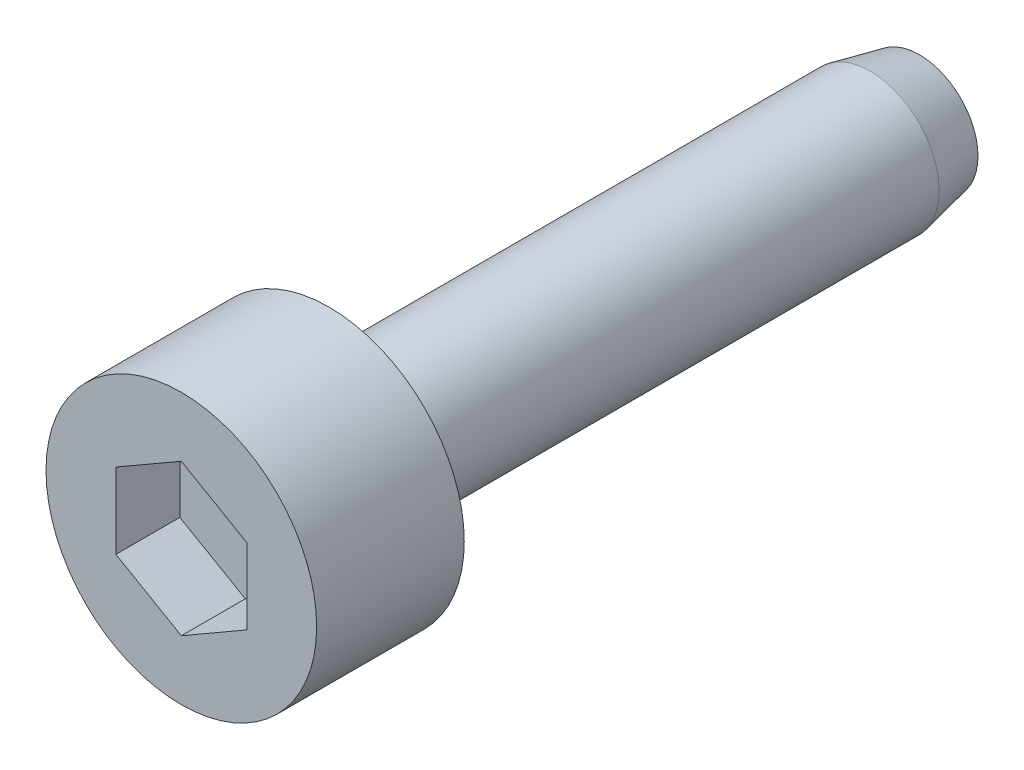
ISO-10303-21;
HEADER;
FILE_DESCRIPTION(('STEP AP214'),'2;1');
FILE_NAME('part.step','',(''),(''),'','','');
FILE_SCHEMA(('AUTOMOTIVE_DESIGN { 1 0 10303 214 1 1 1 1 }'));
ENDSEC;
DATA;
#1=APPLICATION_CONTEXT('core data for automotive mechanical design processes');
#2=APPLICATION_PROTOCOL_DEFINITION('international standard','automotive_design',2000,#1);
#3=PRODUCT_CONTEXT('',#1,'mechanical');
#4=PRODUCT('Part','Part','',(#3));
#5=PRODUCT_RELATED_PRODUCT_CATEGORY('part','',(#4));
#6=PRODUCT_DEFINITION_FORMATION('','',#4);
#7=PRODUCT_DEFINITION_CONTEXT('part definition',#1,'design');
#8=PRODUCT_DEFINITION('design','',#6,#7);
#9=PRODUCT_DEFINITION_SHAPE('','',#8);
#10=(LENGTH_UNIT() NAMED_UNIT(*) SI_UNIT(.MILLI.,.METRE.));
#11=(NAMED_UNIT(*) PLANE_ANGLE_UNIT() SI_UNIT($,.RADIAN.));
#12=(NAMED_UNIT(*) SI_UNIT($,.STERADIAN.) SOLID_ANGLE_UNIT());
#13=UNCERTAINTY_MEASURE_WITH_UNIT(LENGTH_MEASURE(1.E-05),#10,'distance_accuracy_value','');
#14=(GEOMETRIC_REPRESENTATION_CONTEXT(3) GLOBAL_UNCERTAINTY_ASSIGNED_CONTEXT((#13)) GLOBAL_UNIT_ASSIGNED_CONTEXT((#10,
#11,#12)) REPRESENTATION_CONTEXT('',''));
#15=CARTESIAN_POINT('',(0.,0.,0.));
#16=DIRECTION('',(0.,0.,1.));
#17=DIRECTION('',(1.,0.,0.));
#18=AXIS2_PLACEMENT_3D('',#15,#16,#17);
#19=CARTESIAN_POINT('',(0.,0.,-15.));
#20=DIRECTION('',(0.,0.,1.));
#21=DIRECTION('',(1.,0.,0.));
#22=AXIS2_PLACEMENT_3D('',#19,#20,#21);
#23=PLANE('',#22);
#24=CARTESIAN_POINT('',(0.,0.,-15.));
#25=DIRECTION('',(0.,0.,1.));
#26=DIRECTION('',(1.,0.,0.));
#27=AXIS2_PLACEMENT_3D('',#24,#25,#26);
#28=CIRCLE('',#27,1.19);
#29=CARTESIAN_POINT('',(1.19,0.,-15.));
#30=VERTEX_POINT('',#29);
#31=EDGE_CURVE('E10',#30,#30,#28,.T.);
#32=ORIENTED_EDGE('',*,*,#31,.F.);
#33=EDGE_LOOP('',(#32));
#34=FACE_BOUND('',#33,.T.);
#35=ADVANCED_FACE('F16',(#34),#23,.F.);
#36=CARTESIAN_POINT('',(0.,0.,-14.));
#37=DIRECTION('',(0.,0.,1.));
#38=DIRECTION('',(1.,0.,0.));
#39=AXIS2_PLACEMENT_3D('',#36,#37,#38);
#40=CONICAL_SURFACE('',#39,1.4,0.20699219422);
#41=DIRECTION('',(-0.205517234286012,0.,-0.978653496602055));
#42=VECTOR('',#41,1.);
#43=CARTESIAN_POINT('',(1.4,0.,-14.));
#44=LINE('',#43,#42);
#45=CARTESIAN_POINT('',(1.4,0.,-14.));
#46=VERTEX_POINT('',#45);
#47=EDGE_CURVE('E24',#46,#30,#44,.T.);
#48=ORIENTED_EDGE('',*,*,#47,.T.);
#49=ORIENTED_EDGE('',*,*,#31,.T.);
#50=ORIENTED_EDGE('',*,*,#47,.F.);
#51=CARTESIAN_POINT('',(0.,0.,-14.));
#52=DIRECTION('',(0.,0.,1.));
#53=DIRECTION('',(1.,0.,0.));
#54=AXIS2_PLACEMENT_3D('',#51,#52,#53);
#55=CIRCLE('',#54,1.4);
#56=EDGE_CURVE('E198',#46,#46,#55,.T.);
#57=ORIENTED_EDGE('',*,*,#56,.F.);
#58=EDGE_LOOP('',(#48,#49,#50,#57));
#59=FACE_BOUND('',#58,.T.);
#60=ADVANCED_FACE('F202',(#59),#40,.T.);
#61=CARTESIAN_POINT('',(0.,0.,-1.3));
#62=DIRECTION('',(0.,0.,1.));
#63=DIRECTION('',(1.,0.,0.));
#64=AXIS2_PLACEMENT_3D('',#61,#62,#63);
#65=PLANE('',#64);
#66=DIRECTION('',(-0.866025403784329,0.50000000000019,0.));
#67=VECTOR('',#66,1.);
#68=CARTESIAN_POINT('',(1.33,0.767875858022,-1.3));
#69=LINE('',#68,#67);
#70=CARTESIAN_POINT('',(1.33,0.767875858022,-1.3));
#71=VERTEX_POINT('',#70);
#72=CARTESIAN_POINT('',(0.,1.535751716044,-1.3));
#73=VERTEX_POINT('',#72);
#74=EDGE_CURVE('E128',#71,#73,#69,.T.);
#75=ORIENTED_EDGE('',*,*,#74,.T.);
#76=DIRECTION('',(-0.866025403784329,-0.50000000000019,0.));
#77=VECTOR('',#76,1.);
#78=CARTESIAN_POINT('',(0.,1.535751716044,-1.3));
#79=LINE('',#78,#77);
#80=CARTESIAN_POINT('',(-1.33,0.767875858022,-1.3));
#81=VERTEX_POINT('',#80);
#82=EDGE_CURVE('E125',#73,#81,#79,.T.);
#83=ORIENTED_EDGE('',*,*,#82,.T.);
#84=DIRECTION('',(0.,-1.,0.));
#85=VECTOR('',#84,1.);
#86=CARTESIAN_POINT('',(-1.33,0.767875858022,-1.3));
#87=LINE('',#86,#85);
#88=CARTESIAN_POINT('',(-1.33,-0.767875858022,-1.3));
#89=VERTEX_POINT('',#88);
#90=EDGE_CURVE('E179',#81,#89,#87,.T.);
#91=ORIENTED_EDGE('',*,*,#90,.T.);
#92=DIRECTION('',(0.866025403784329,-0.50000000000019,0.));
#93=VECTOR('',#92,1.);
#94=CARTESIAN_POINT('',(-1.33,-0.767875858022,-1.3));
#95=LINE('',#94,#93);
#96=CARTESIAN_POINT('',(0.,-1.535751716044,-1.3));
#97=VERTEX_POINT('',#96);
#98=EDGE_CURVE('E95',#89,#97,#95,.T.);
#99=ORIENTED_EDGE('',*,*,#98,.T.);
#100=DIRECTION('',(0.866025403784329,0.50000000000019,0.));
#101=VECTOR('',#100,1.);
#102=CARTESIAN_POINT('',(0.,-1.535751716044,-1.3));
#103=LINE('',#102,#101);
#104=CARTESIAN_POINT('',(1.33,-0.767875858022,-1.3));
#105=VERTEX_POINT('',#104);
#106=EDGE_CURVE('E85',#97,#105,#103,.T.);
#107=ORIENTED_EDGE('',*,*,#106,.T.);
#108=DIRECTION('',(0.,1.,0.));
#109=VECTOR('',#108,1.);
#110=CARTESIAN_POINT('',(1.33,-0.767875858022,-1.3));
#111=LINE('',#110,#109);
#112=EDGE_CURVE('E192',#105,#71,#111,.T.);
#113=ORIENTED_EDGE('',*,*,#112,.T.);
#114=EDGE_LOOP('',(#75,#83,#91,#99,#107,#113));
#115=FACE_BOUND('',#114,.T.);
#116=ADVANCED_FACE('F231',(#115),#65,.T.);
#117=CARTESIAN_POINT('',(0.,0.,-15.));
#118=DIRECTION('',(0.,0.,1.));
#119=DIRECTION('',(1.,0.,0.));
#120=AXIS2_PLACEMENT_3D('',#117,#118,#119);
#121=CYLINDRICAL_SURFACE('',#120,1.4);
#122=DIRECTION('',(0.,0.,1.));
#123=VECTOR('',#122,1.);
#124=CARTESIAN_POINT('',(1.4,0.,-15.));
#125=LINE('',#124,#123);
#126=CARTESIAN_POINT('',(1.4,0.,-3.));
#127=VERTEX_POINT('',#126);
#128=EDGE_CURVE('E195',#46,#127,#125,.T.);
#129=ORIENTED_EDGE('',*,*,#128,.T.);
#130=CARTESIAN_POINT('',(0.,0.,-3.));
#131=DIRECTION('',(0.,0.,1.));
#132=DIRECTION('',(1.,0.,0.));
#133=AXIS2_PLACEMENT_3D('',#130,#131,#132);
#134=CIRCLE('',#133,1.4);
#135=EDGE_CURVE('E129',#127,#127,#134,.T.);
#136=ORIENTED_EDGE('',*,*,#135,.F.);
#137=ORIENTED_EDGE('',*,*,#128,.F.);
#138=ORIENTED_EDGE('',*,*,#56,.T.);
#139=EDGE_LOOP('',(#129,#136,#137,#138));
#140=FACE_BOUND('',#139,.T.);
#141=ADVANCED_FACE('F206',(#140),#121,.T.);
#142=CARTESIAN_POINT('',(1.33,-0.767875858022,0.));
#143=DIRECTION('',(1.,0.,0.));
#144=DIRECTION('',(0.,1.,0.));
#145=AXIS2_PLACEMENT_3D('',#142,#143,#144);
#146=PLANE('',#145);
#147=DIRECTION('',(0.,1.,0.));
#148=VECTOR('',#147,1.);
#149=CARTESIAN_POINT('',(1.33,-0.767875858022,0.));
#150=LINE('',#149,#148);
#151=CARTESIAN_POINT('',(1.33,-0.767875858022,0.));
#152=VERTEX_POINT('',#151);
#153=CARTESIAN_POINT('',(1.33,0.767875858022,0.));
#154=VERTEX_POINT('',#153);
#155=EDGE_CURVE('E144',#152,#154,#150,.T.);
#156=ORIENTED_EDGE('',*,*,#155,.T.);
#157=DIRECTION('',(0.,0.,-1.));
#158=VECTOR('',#157,1.);
#159=CARTESIAN_POINT('',(1.33,0.767875858022,0.));
#160=LINE('',#159,#158);
#161=EDGE_CURVE('E111',#154,#71,#160,.T.);
#162=ORIENTED_EDGE('',*,*,#161,.T.);
#163=ORIENTED_EDGE('',*,*,#112,.F.);
#164=DIRECTION('',(0.,0.,-1.));
#165=VECTOR('',#164,1.);
#166=CARTESIAN_POINT('',(1.33,-0.767875858022,0.));
#167=LINE('',#166,#165);
#168=EDGE_CURVE('E159',#152,#105,#167,.T.);
#169=ORIENTED_EDGE('',*,*,#168,.F.);
#170=EDGE_LOOP('',(#156,#162,#163,#169));
#171=FACE_BOUND('',#170,.T.);
#172=ADVANCED_FACE('F233',(#171),#146,.F.);
#173=CARTESIAN_POINT('',(0.,-1.535751716044,0.));
#174=DIRECTION('',(0.50000000000019,-0.866025403784329,0.));
#175=DIRECTION('',(0.,0.,-1.));
#176=AXIS2_PLACEMENT_3D('',#173,#174,#175);
#177=PLANE('',#176);
#178=DIRECTION('',(0.866025403784329,0.50000000000019,0.));
#179=VECTOR('',#178,1.);
#180=CARTESIAN_POINT('',(0.,-1.535751716044,0.));
#181=LINE('',#180,#179);
#182=CARTESIAN_POINT('',(0.,-1.535751716044,0.));
#183=VERTEX_POINT('',#182);
#184=EDGE_CURVE('E151',#183,#152,#181,.T.);
#185=ORIENTED_EDGE('',*,*,#184,.T.);
#186=ORIENTED_EDGE('',*,*,#168,.T.);
#187=ORIENTED_EDGE('',*,*,#106,.F.);
#188=DIRECTION('',(0.,0.,-1.));
#189=VECTOR('',#188,1.);
#190=CARTESIAN_POINT('',(0.,-1.535751716044,0.));
#191=LINE('',#190,#189);
#192=EDGE_CURVE('E182',#183,#97,#191,.T.);
#193=ORIENTED_EDGE('',*,*,#192,.F.);
#194=EDGE_LOOP('',(#185,#186,#187,#193));
#195=FACE_BOUND('',#194,.T.);
#196=ADVANCED_FACE('F236',(#195),#177,.F.);
#197=CARTESIAN_POINT('',(-1.33,-0.767875858022,0.));
#198=DIRECTION('',(-0.50000000000019,-0.866025403784329,0.));
#199=DIRECTION('',(-0.866025403784329,0.50000000000019,0.));
#200=AXIS2_PLACEMENT_3D('',#197,#198,#199);
#201=PLANE('',#200);
#202=DIRECTION('',(0.866025403784329,-0.50000000000019,0.));
#203=VECTOR('',#202,1.);
#204=CARTESIAN_POINT('',(-1.33,-0.767875858022,0.));
#205=LINE('',#204,#203);
#206=CARTESIAN_POINT('',(-1.33,-0.767875858022,0.));
#207=VERTEX_POINT('',#206);
#208=EDGE_CURVE('E163',#207,#183,#205,.T.);
#209=ORIENTED_EDGE('',*,*,#208,.T.);
#210=ORIENTED_EDGE('',*,*,#192,.T.);
#211=ORIENTED_EDGE('',*,*,#98,.F.);
#212=DIRECTION('',(0.,0.,-1.));
#213=VECTOR('',#212,1.);
#214=CARTESIAN_POINT('',(-1.33,-0.767875858022,0.));
#215=LINE('',#214,#213);
#216=EDGE_CURVE('E175',#207,#89,#215,.T.);
#217=ORIENTED_EDGE('',*,*,#216,.F.);
#218=EDGE_LOOP('',(#209,#210,#211,#217));
#219=FACE_BOUND('',#218,.T.);
#220=ADVANCED_FACE('F237',(#219),#201,.F.);
#221=CARTESIAN_POINT('',(-1.33,0.767875858022,0.));
#222=DIRECTION('',(-1.,0.,0.));
#223=DIRECTION('',(0.,0.,1.));
#224=AXIS2_PLACEMENT_3D('',#221,#222,#223);
#225=PLANE('',#224);
#226=DIRECTION('',(0.,-1.,0.));
#227=VECTOR('',#226,1.);
#228=CARTESIAN_POINT('',(-1.33,0.767875858022,0.));
#229=LINE('',#228,#227);
#230=CARTESIAN_POINT('',(-1.33,0.767875858022,0.));
#231=VERTEX_POINT('',#230);
#232=EDGE_CURVE('E139',#231,#207,#229,.T.);
#233=ORIENTED_EDGE('',*,*,#232,.T.);
#234=ORIENTED_EDGE('',*,*,#216,.T.);
#235=ORIENTED_EDGE('',*,*,#90,.F.);
#236=DIRECTION('',(0.,0.,-1.));
#237=VECTOR('',#236,1.);
#238=CARTESIAN_POINT('',(-1.33,0.767875858022,0.));
#239=LINE('',#238,#237);
#240=EDGE_CURVE('E185',#231,#81,#239,.T.);
#241=ORIENTED_EDGE('',*,*,#240,.F.);
#242=EDGE_LOOP('',(#233,#234,#235,#241));
#243=FACE_BOUND('',#242,.T.);
#244=ADVANCED_FACE('F229',(#243),#225,.F.);
#245=CARTESIAN_POINT('',(0.,1.535751716044,0.));
#246=DIRECTION('',(-0.50000000000019,0.866025403784329,0.));
#247=DIRECTION('',(0.,0.,1.));
#248=AXIS2_PLACEMENT_3D('',#245,#246,#247);
#249=PLANE('',#248);
#250=DIRECTION('',(-0.866025403784329,-0.50000000000019,0.));
#251=VECTOR('',#250,1.);
#252=CARTESIAN_POINT('',(0.,1.535751716044,0.));
#253=LINE('',#252,#251);
#254=CARTESIAN_POINT('',(0.,1.535751716044,0.));
#255=VERTEX_POINT('',#254);
#256=EDGE_CURVE('E122',#255,#231,#253,.T.);
#257=ORIENTED_EDGE('',*,*,#256,.T.);
#258=ORIENTED_EDGE('',*,*,#240,.T.);
#259=ORIENTED_EDGE('',*,*,#82,.F.);
#260=DIRECTION('',(0.,0.,-1.));
#261=VECTOR('',#260,1.);
#262=CARTESIAN_POINT('',(0.,1.535751716044,0.));
#263=LINE('',#262,#261);
#264=EDGE_CURVE('E118',#255,#73,#263,.T.);
#265=ORIENTED_EDGE('',*,*,#264,.F.);
#266=EDGE_LOOP('',(#257,#258,#259,#265));
#267=FACE_BOUND('',#266,.T.);
#268=ADVANCED_FACE('F120',(#267),#249,.F.);
#269=CARTESIAN_POINT('',(1.33,0.767875858022,0.));
#270=DIRECTION('',(0.50000000000019,0.866025403784329,0.));
#271=DIRECTION('',(0.,0.,-1.));
#272=AXIS2_PLACEMENT_3D('',#269,#270,#271);
#273=PLANE('',#272);
#274=DIRECTION('',(-0.866025403784329,0.50000000000019,0.));
#275=VECTOR('',#274,1.);
#276=CARTESIAN_POINT('',(1.33,0.767875858022,0.));
#277=LINE('',#276,#275);
#278=EDGE_CURVE('E136',#154,#255,#277,.T.);
#279=ORIENTED_EDGE('',*,*,#278,.T.);
#280=ORIENTED_EDGE('',*,*,#264,.T.);
#281=ORIENTED_EDGE('',*,*,#74,.F.);
#282=ORIENTED_EDGE('',*,*,#161,.F.);
#283=EDGE_LOOP('',(#279,#280,#281,#282));
#284=FACE_BOUND('',#283,.T.);
#285=ADVANCED_FACE('F142',(#284),#273,.F.);
#286=CARTESIAN_POINT('',(0.,0.,-3.));
#287=DIRECTION('',(0.,0.,1.));
#288=DIRECTION('',(1.,0.,0.));
#289=AXIS2_PLACEMENT_3D('',#286,#287,#288);
#290=PLANE('',#289);
#291=ORIENTED_EDGE('',*,*,#135,.T.);
#292=EDGE_LOOP('',(#291));
#293=FACE_BOUND('',#292,.T.);
#294=CARTESIAN_POINT('',(0.,0.,-3.));
#295=DIRECTION('',(0.,0.,1.));
#296=DIRECTION('',(1.,0.,0.));
#297=AXIS2_PLACEMENT_3D('',#294,#295,#296);
#298=CIRCLE('',#297,2.75);
#299=CARTESIAN_POINT('',(2.75,0.,-3.));
#300=VERTEX_POINT('',#299);
#301=EDGE_CURVE('E145',#300,#300,#298,.T.);
#302=ORIENTED_EDGE('',*,*,#301,.F.);
#303=EDGE_LOOP('',(#302));
#304=FACE_BOUND('',#303,.T.);
#305=ADVANCED_FACE('F208',(#293,#304),#290,.F.);
#306=CARTESIAN_POINT('',(0.,0.,0.));
#307=DIRECTION('',(0.,0.,1.));
#308=DIRECTION('',(1.,0.,0.));
#309=AXIS2_PLACEMENT_3D('',#306,#307,#308);
#310=PLANE('',#309);
#311=ORIENTED_EDGE('',*,*,#278,.F.);
#312=ORIENTED_EDGE('',*,*,#155,.F.);
#313=ORIENTED_EDGE('',*,*,#184,.F.);
#314=ORIENTED_EDGE('',*,*,#208,.F.);
#315=ORIENTED_EDGE('',*,*,#232,.F.);
#316=ORIENTED_EDGE('',*,*,#256,.F.);
#317=EDGE_LOOP('',(#311,#312,#313,#314,#315,#316));
#318=FACE_BOUND('',#317,.T.);
#319=CARTESIAN_POINT('',(0.,0.,0.));
#320=DIRECTION('',(0.,0.,1.));
#321=DIRECTION('',(1.,0.,0.));
#322=AXIS2_PLACEMENT_3D('',#319,#320,#321);
#323=CIRCLE('',#322,2.75);
#324=CARTESIAN_POINT('',(2.75,0.,0.));
#325=VERTEX_POINT('',#324);
#326=EDGE_CURVE('E219',#325,#325,#323,.T.);
#327=ORIENTED_EDGE('',*,*,#326,.T.);
#328=EDGE_LOOP('',(#327));
#329=FACE_BOUND('',#328,.T.);
#330=ADVANCED_FACE('F133',(#318,#329),#310,.T.);
#331=CARTESIAN_POINT('',(0.,0.,-3.));
#332=DIRECTION('',(0.,0.,1.));
#333=DIRECTION('',(1.,0.,0.));
#334=AXIS2_PLACEMENT_3D('',#331,#332,#333);
#335=CYLINDRICAL_SURFACE('',#334,2.75);
#336=ORIENTED_EDGE('',*,*,#326,.F.);
#337=DIRECTION('',(0.,0.,1.));
#338=VECTOR('',#337,1.);
#339=CARTESIAN_POINT('',(2.75,0.,-3.));
#340=LINE('',#339,#338);
#341=EDGE_CURVE('E154',#300,#325,#340,.T.);
#342=ORIENTED_EDGE('',*,*,#341,.F.);
#343=ORIENTED_EDGE('',*,*,#301,.T.);
#344=ORIENTED_EDGE('',*,*,#341,.T.);
#345=EDGE_LOOP('',(#336,#342,#343,#344));
#346=FACE_BOUND('',#345,.T.);
#347=ADVANCED_FACE('F217',(#346),#335,.T.);
#348=CLOSED_SHELL('',(#35,#60,#116,#141,#172,#196,#220,#244,#268,#285,#305,#330,#347));
#349=MANIFOLD_SOLID_BREP('B1',#348);
#350=ADVANCED_BREP_SHAPE_REPRESENTATION('',(#18,#349),#14);
#351=SHAPE_DEFINITION_REPRESENTATION(#9,#350);
ENDSEC;
END-ISO-10303-21;
